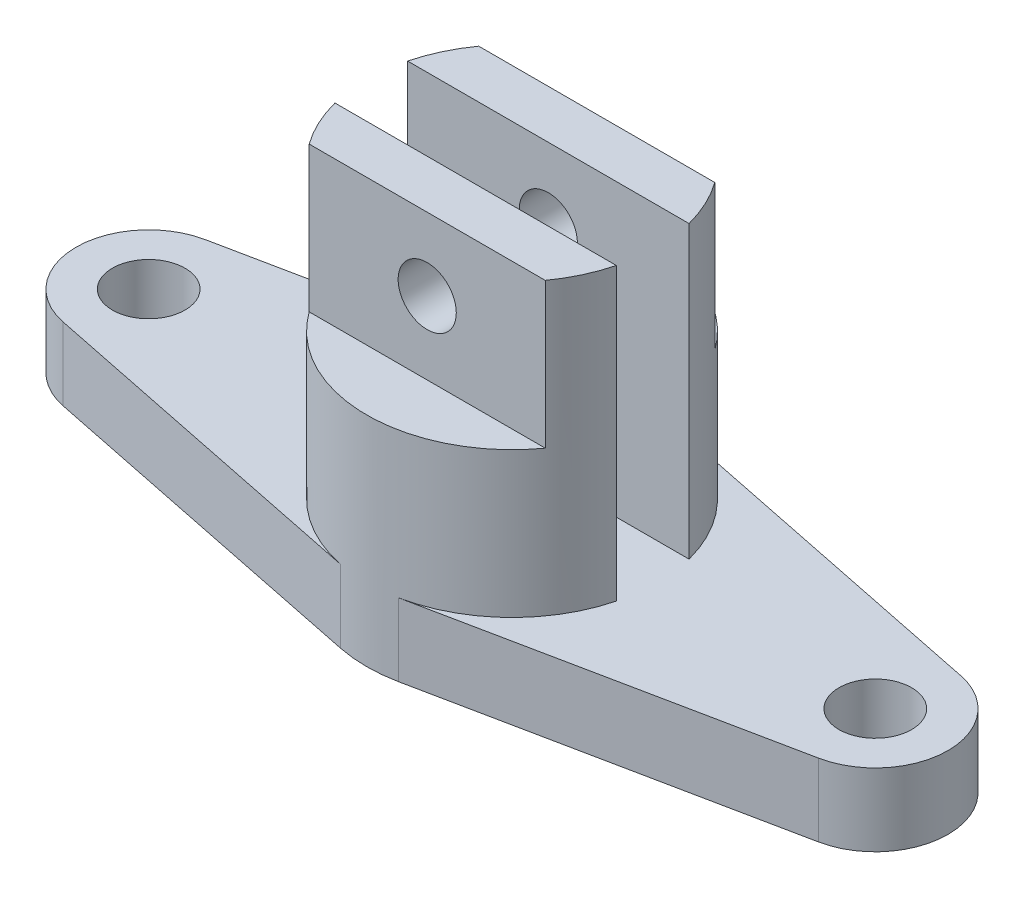
ISO-10303-21;
HEADER;
FILE_DESCRIPTION(('STEP AP214'),'2;1');
FILE_NAME('part.step','',(''),(''),'','','');
FILE_SCHEMA(('AUTOMOTIVE_DESIGN { 1 0 10303 214 1 1 1 1 }'));
ENDSEC;
DATA;
#1=APPLICATION_CONTEXT('core data for automotive mechanical design processes');
#2=APPLICATION_PROTOCOL_DEFINITION('international standard','automotive_design',2000,#1);
#3=PRODUCT_CONTEXT('',#1,'mechanical');
#4=PRODUCT('Part','Part','',(#3));
#5=PRODUCT_RELATED_PRODUCT_CATEGORY('part','',(#4));
#6=PRODUCT_DEFINITION_FORMATION('','',#4);
#7=PRODUCT_DEFINITION_CONTEXT('part definition',#1,'design');
#8=PRODUCT_DEFINITION('design','',#6,#7);
#9=PRODUCT_DEFINITION_SHAPE('','',#8);
#10=(LENGTH_UNIT() NAMED_UNIT(*) SI_UNIT(.MILLI.,.METRE.));
#11=(NAMED_UNIT(*) PLANE_ANGLE_UNIT() SI_UNIT($,.RADIAN.));
#12=(NAMED_UNIT(*) SI_UNIT($,.STERADIAN.) SOLID_ANGLE_UNIT());
#13=UNCERTAINTY_MEASURE_WITH_UNIT(LENGTH_MEASURE(1.E-05),#10,'distance_accuracy_value','');
#14=(GEOMETRIC_REPRESENTATION_CONTEXT(3) GLOBAL_UNCERTAINTY_ASSIGNED_CONTEXT((#13)) GLOBAL_UNIT_ASSIGNED_CONTEXT((#10,
#11,#12)) REPRESENTATION_CONTEXT('',''));
#15=CARTESIAN_POINT('',(0.,0.,0.));
#16=DIRECTION('',(0.,0.,1.));
#17=DIRECTION('',(1.,0.,0.));
#18=AXIS2_PLACEMENT_3D('',#15,#16,#17);
#19=CARTESIAN_POINT('',(0.,75.,0.));
#20=DIRECTION('',(0.,-1.,0.));
#21=DIRECTION('',(0.,0.,-1.));
#22=AXIS2_PLACEMENT_3D('',#19,#20,#21);
#23=CYLINDRICAL_SURFACE('',#22,30.);
#24=CARTESIAN_POINT('',(0.,15.,0.));
#25=DIRECTION('',(0.,1.,0.));
#26=DIRECTION('',(0.,0.,1.));
#27=AXIS2_PLACEMENT_3D('',#24,#25,#26);
#28=CIRCLE('',#27,30.);
#29=CARTESIAN_POINT('',(29.0473750965556,15.,-7.5));
#30=VERTEX_POINT('',#29);
#31=CARTESIAN_POINT('',(5.99999999999999,15.,-29.3938769133981));
#32=VERTEX_POINT('',#31);
#33=EDGE_CURVE('E62',#30,#32,#28,.T.);
#34=ORIENTED_EDGE('',*,*,#33,.T.);
#35=DIRECTION('',(0.,-1.,0.));
#36=VECTOR('',#35,1.);
#37=CARTESIAN_POINT('',(6.,15.,-29.3938769133981));
#38=LINE('',#37,#36);
#39=CARTESIAN_POINT('',(6.00000000000001,0.,-29.3938769133981));
#40=VERTEX_POINT('',#39);
#41=EDGE_CURVE('E258',#32,#40,#38,.T.);
#42=ORIENTED_EDGE('',*,*,#41,.T.);
#43=CARTESIAN_POINT('',(0.,0.,0.));
#44=DIRECTION('',(0.,1.,0.));
#45=DIRECTION('',(0.,0.,1.));
#46=AXIS2_PLACEMENT_3D('',#43,#44,#45);
#47=CIRCLE('',#46,30.);
#48=CARTESIAN_POINT('',(-6.,0.,-29.3938769133981));
#49=VERTEX_POINT('',#48);
#50=EDGE_CURVE('E270',#40,#49,#47,.T.);
#51=ORIENTED_EDGE('',*,*,#50,.T.);
#52=DIRECTION('',(0.,-1.,0.));
#53=VECTOR('',#52,1.);
#54=CARTESIAN_POINT('',(-6.,15.,-29.3938769133981));
#55=LINE('',#54,#53);
#56=CARTESIAN_POINT('',(-6.,15.,-29.3938769133981));
#57=VERTEX_POINT('',#56);
#58=EDGE_CURVE('E69',#57,#49,#55,.T.);
#59=ORIENTED_EDGE('',*,*,#58,.F.);
#60=CARTESIAN_POINT('',(-29.0473750965556,15.,-7.5));
#61=VERTEX_POINT('',#60);
#62=EDGE_CURVE('E212',#57,#61,#28,.T.);
#63=ORIENTED_EDGE('',*,*,#62,.T.);
#64=DIRECTION('',(0.,-1.,0.));
#65=VECTOR('',#64,1.);
#66=CARTESIAN_POINT('',(-29.0473750965556,75.,-7.5));
#67=LINE('',#66,#65);
#68=CARTESIAN_POINT('',(-29.0473750965556,75.,-7.5));
#69=VERTEX_POINT('',#68);
#70=EDGE_CURVE('E281',#69,#61,#67,.T.);
#71=ORIENTED_EDGE('',*,*,#70,.F.);
#72=CARTESIAN_POINT('',(0.,75.,0.));
#73=DIRECTION('',(0.,1.,0.));
#74=DIRECTION('',(0.,0.,1.));
#75=AXIS2_PLACEMENT_3D('',#72,#73,#74);
#76=CIRCLE('',#75,30.);
#77=CARTESIAN_POINT('',(-24.3669858620224,75.,-17.5));
#78=VERTEX_POINT('',#77);
#79=EDGE_CURVE('E277',#78,#69,#76,.T.);
#80=ORIENTED_EDGE('',*,*,#79,.F.);
#81=DIRECTION('',(0.,-1.,0.));
#82=VECTOR('',#81,1.);
#83=CARTESIAN_POINT('',(-24.3669858620224,75.,-17.5));
#84=LINE('',#83,#82);
#85=CARTESIAN_POINT('',(-24.3669858620224,45.,-17.5));
#86=VERTEX_POINT('',#85);
#87=EDGE_CURVE('E284',#78,#86,#84,.T.);
#88=ORIENTED_EDGE('',*,*,#87,.T.);
#89=CARTESIAN_POINT('',(0.,45.,0.));
#90=DIRECTION('',(0.,1.,0.));
#91=DIRECTION('',(0.,0.,1.));
#92=AXIS2_PLACEMENT_3D('',#89,#90,#91);
#93=CIRCLE('',#92,30.);
#94=CARTESIAN_POINT('',(24.3669858620224,45.,-17.5));
#95=VERTEX_POINT('',#94);
#96=EDGE_CURVE('E268',#95,#86,#93,.T.);
#97=ORIENTED_EDGE('',*,*,#96,.F.);
#98=DIRECTION('',(0.,-1.,0.));
#99=VECTOR('',#98,1.);
#100=CARTESIAN_POINT('',(24.3669858620224,75.,-17.5));
#101=LINE('',#100,#99);
#102=CARTESIAN_POINT('',(24.3669858620224,75.,-17.5));
#103=VERTEX_POINT('',#102);
#104=EDGE_CURVE('E56',#103,#95,#101,.T.);
#105=ORIENTED_EDGE('',*,*,#104,.F.);
#106=CARTESIAN_POINT('',(29.0473750965556,75.,-7.5));
#107=VERTEX_POINT('',#106);
#108=EDGE_CURVE('E274',#107,#103,#76,.T.);
#109=ORIENTED_EDGE('',*,*,#108,.F.);
#110=DIRECTION('',(0.,-1.,0.));
#111=VECTOR('',#110,1.);
#112=CARTESIAN_POINT('',(29.0473750965556,75.,-7.5));
#113=LINE('',#112,#111);
#114=EDGE_CURVE('E13',#107,#30,#113,.T.);
#115=ORIENTED_EDGE('',*,*,#114,.T.);
#116=EDGE_LOOP('',(#34,#42,#51,#59,#63,#71,#80,#88,#97,#105,#109,#115));
#117=FACE_BOUND('',#116,.T.);
#118=ADVANCED_FACE('F47',(#117),#23,.T.);
#119=CARTESIAN_POINT('',(0.,75.,-7.5));
#120=DIRECTION('',(0.,0.,1.));
#121=DIRECTION('',(1.,0.,0.));
#122=AXIS2_PLACEMENT_3D('',#119,#120,#121);
#123=PLANE('',#122);
#124=CARTESIAN_POINT('',(0.,60.,-7.5));
#125=DIRECTION('',(0.,0.,1.));
#126=DIRECTION('',(1.,0.,0.));
#127=AXIS2_PLACEMENT_3D('',#124,#125,#126);
#128=CIRCLE('',#127,6.);
#129=CARTESIAN_POINT('',(6.,60.,-7.5));
#130=VERTEX_POINT('',#129);
#131=EDGE_CURVE('E330',#130,#130,#128,.T.);
#132=ORIENTED_EDGE('',*,*,#131,.F.);
#133=EDGE_LOOP('',(#132));
#134=FACE_BOUND('',#133,.T.);
#135=DIRECTION('',(-1.,0.,0.));
#136=VECTOR('',#135,1.);
#137=CARTESIAN_POINT('',(0.,15.,-7.5));
#138=LINE('',#137,#136);
#139=EDGE_CURVE('E211',#30,#61,#138,.T.);
#140=ORIENTED_EDGE('',*,*,#139,.F.);
#141=ORIENTED_EDGE('',*,*,#114,.F.);
#142=DIRECTION('',(-1.,0.,0.));
#143=VECTOR('',#142,1.);
#144=CARTESIAN_POINT('',(0.,75.,-7.5));
#145=LINE('',#144,#143);
#146=EDGE_CURVE('E271',#107,#69,#145,.T.);
#147=ORIENTED_EDGE('',*,*,#146,.T.);
#148=ORIENTED_EDGE('',*,*,#70,.T.);
#149=EDGE_LOOP('',(#140,#141,#147,#148));
#150=FACE_BOUND('',#149,.T.);
#151=ADVANCED_FACE('F49',(#134,#150),#123,.T.);
#152=CARTESIAN_POINT('',(0.,75.,-17.5));
#153=DIRECTION('',(0.,0.,-1.));
#154=DIRECTION('',(-1.,0.,0.));
#155=AXIS2_PLACEMENT_3D('',#152,#153,#154);
#156=PLANE('',#155);
#157=CARTESIAN_POINT('',(0.,60.,-17.5));
#158=DIRECTION('',(0.,0.,-1.));
#159=DIRECTION('',(-1.,0.,0.));
#160=AXIS2_PLACEMENT_3D('',#157,#158,#159);
#161=CIRCLE('',#160,6.);
#162=CARTESIAN_POINT('',(-6.,60.,-17.5));
#163=VERTEX_POINT('',#162);
#164=EDGE_CURVE('E328',#163,#163,#161,.T.);
#165=ORIENTED_EDGE('',*,*,#164,.F.);
#166=EDGE_LOOP('',(#165));
#167=FACE_BOUND('',#166,.T.);
#168=DIRECTION('',(1.,0.,0.));
#169=VECTOR('',#168,1.);
#170=CARTESIAN_POINT('',(0.,45.,-17.5));
#171=LINE('',#170,#169);
#172=EDGE_CURVE('E265',#86,#95,#171,.T.);
#173=ORIENTED_EDGE('',*,*,#172,.F.);
#174=ORIENTED_EDGE('',*,*,#87,.F.);
#175=DIRECTION('',(1.,0.,0.));
#176=VECTOR('',#175,1.);
#177=CARTESIAN_POINT('',(0.,75.,-17.5));
#178=LINE('',#177,#176);
#179=EDGE_CURVE('E276',#78,#103,#178,.T.);
#180=ORIENTED_EDGE('',*,*,#179,.T.);
#181=ORIENTED_EDGE('',*,*,#104,.T.);
#182=EDGE_LOOP('',(#173,#174,#180,#181));
#183=FACE_BOUND('',#182,.T.);
#184=ADVANCED_FACE('F291',(#167,#183),#156,.T.);
#185=CARTESIAN_POINT('',(0.,75.,0.));
#186=DIRECTION('',(0.,1.,0.));
#187=DIRECTION('',(0.,0.,1.));
#188=AXIS2_PLACEMENT_3D('',#185,#186,#187);
#189=PLANE('',#188);
#190=ORIENTED_EDGE('',*,*,#146,.F.);
#191=ORIENTED_EDGE('',*,*,#108,.T.);
#192=ORIENTED_EDGE('',*,*,#179,.F.);
#193=ORIENTED_EDGE('',*,*,#79,.T.);
#194=EDGE_LOOP('',(#190,#191,#192,#193));
#195=FACE_BOUND('',#194,.T.);
#196=ADVANCED_FACE('F309',(#195),#189,.T.);
#197=CARTESIAN_POINT('',(0.,0.,0.));
#198=DIRECTION('',(0.,1.,0.));
#199=DIRECTION('',(0.,0.,1.));
#200=AXIS2_PLACEMENT_3D('',#197,#198,#199);
#201=PLANE('',#200);
#202=CARTESIAN_POINT('',(0.,0.,0.));
#203=DIRECTION('',(0.,1.,0.));
#204=DIRECTION('',(0.,0.,1.));
#205=AXIS2_PLACEMENT_3D('',#202,#203,#204);
#206=CIRCLE('',#205,30.);
#207=CARTESIAN_POINT('',(-6.,0.,29.3938769133981));
#208=VERTEX_POINT('',#207);
#209=CARTESIAN_POINT('',(6.,0.,29.3938769133981));
#210=VERTEX_POINT('',#209);
#211=EDGE_CURVE('E182',#208,#210,#206,.T.);
#212=ORIENTED_EDGE('',*,*,#211,.F.);
#213=DIRECTION('',(0.979795897113271,0.,0.2));
#214=VECTOR('',#213,1.);
#215=CARTESIAN_POINT('',(-6.,0.,29.3938769133981));
#216=LINE('',#215,#214);
#217=CARTESIAN_POINT('',(-78.,0.,14.6969384566991));
#218=VERTEX_POINT('',#217);
#219=EDGE_CURVE('E200',#218,#208,#216,.T.);
#220=ORIENTED_EDGE('',*,*,#219,.F.);
#221=CARTESIAN_POINT('',(-75.,0.,0.));
#222=DIRECTION('',(0.,1.,0.));
#223=DIRECTION('',(0.,0.,1.));
#224=AXIS2_PLACEMENT_3D('',#221,#222,#223);
#225=CIRCLE('',#224,15.);
#226=CARTESIAN_POINT('',(-78.,0.,-14.6969384566991));
#227=VERTEX_POINT('',#226);
#228=EDGE_CURVE('E244',#227,#218,#225,.T.);
#229=ORIENTED_EDGE('',*,*,#228,.F.);
#230=DIRECTION('',(0.979795897113271,0.,-0.2));
#231=VECTOR('',#230,1.);
#232=CARTESIAN_POINT('',(-6.,0.,-29.3938769133981));
#233=LINE('',#232,#231);
#234=EDGE_CURVE('E241',#227,#49,#233,.T.);
#235=ORIENTED_EDGE('',*,*,#234,.T.);
#236=ORIENTED_EDGE('',*,*,#50,.F.);
#237=DIRECTION('',(-0.979795897113271,0.,-0.2));
#238=VECTOR('',#237,1.);
#239=CARTESIAN_POINT('',(5.99999999999999,0.,-29.3938769133981));
#240=LINE('',#239,#238);
#241=CARTESIAN_POINT('',(78.,0.,-14.6969384566991));
#242=VERTEX_POINT('',#241);
#243=EDGE_CURVE('E238',#242,#40,#240,.T.);
#244=ORIENTED_EDGE('',*,*,#243,.F.);
#245=CARTESIAN_POINT('',(75.,0.,0.));
#246=DIRECTION('',(0.,1.,0.));
#247=DIRECTION('',(0.,0.,1.));
#248=AXIS2_PLACEMENT_3D('',#245,#246,#247);
#249=CIRCLE('',#248,15.);
#250=CARTESIAN_POINT('',(78.,0.,14.696938456699));
#251=VERTEX_POINT('',#250);
#252=EDGE_CURVE('E235',#251,#242,#249,.T.);
#253=ORIENTED_EDGE('',*,*,#252,.F.);
#254=DIRECTION('',(-0.979795897113271,0.,0.2));
#255=VECTOR('',#254,1.);
#256=CARTESIAN_POINT('',(5.99999999999999,0.,29.3938769133981));
#257=LINE('',#256,#255);
#258=EDGE_CURVE('E232',#251,#210,#257,.T.);
#259=ORIENTED_EDGE('',*,*,#258,.T.);
#260=EDGE_LOOP('',(#212,#220,#229,#235,#236,#244,#253,#259));
#261=FACE_BOUND('',#260,.T.);
#262=CARTESIAN_POINT('',(-75.,0.,0.));
#263=DIRECTION('',(0.,1.,0.));
#264=DIRECTION('',(0.,0.,1.));
#265=AXIS2_PLACEMENT_3D('',#262,#263,#264);
#266=CIRCLE('',#265,7.50000000000001);
#267=CARTESIAN_POINT('',(-75.,0.,7.50000000000001));
#268=VERTEX_POINT('',#267);
#269=EDGE_CURVE('E187',#268,#268,#266,.T.);
#270=ORIENTED_EDGE('',*,*,#269,.T.);
#271=EDGE_LOOP('',(#270));
#272=FACE_BOUND('',#271,.T.);
#273=CARTESIAN_POINT('',(75.,0.,0.));
#274=DIRECTION('',(0.,1.,0.));
#275=DIRECTION('',(0.,0.,1.));
#276=AXIS2_PLACEMENT_3D('',#273,#274,#275);
#277=CIRCLE('',#276,7.50000000000003);
#278=CARTESIAN_POINT('',(75.,0.,7.50000000000003));
#279=VERTEX_POINT('',#278);
#280=EDGE_CURVE('E190',#279,#279,#277,.T.);
#281=ORIENTED_EDGE('',*,*,#280,.T.);
#282=EDGE_LOOP('',(#281));
#283=FACE_BOUND('',#282,.T.);
#284=ADVANCED_FACE('F300',(#261,#272,#283),#201,.F.);
#285=CARTESIAN_POINT('',(0.,45.,0.));
#286=DIRECTION('',(0.,1.,0.));
#287=DIRECTION('',(0.,0.,1.));
#288=AXIS2_PLACEMENT_3D('',#285,#286,#287);
#289=PLANE('',#288);
#290=ORIENTED_EDGE('',*,*,#172,.T.);
#291=ORIENTED_EDGE('',*,*,#96,.T.);
#292=EDGE_LOOP('',(#290,#291));
#293=FACE_BOUND('',#292,.T.);
#294=ADVANCED_FACE('F297',(#293),#289,.T.);
#295=CARTESIAN_POINT('',(5.99999999999999,15.,29.3938769133981));
#296=DIRECTION('',(0.2,0.,0.979795897113271));
#297=DIRECTION('',(0.979795897113271,0.,-0.2));
#298=AXIS2_PLACEMENT_3D('',#295,#296,#297);
#299=PLANE('',#298);
#300=ORIENTED_EDGE('',*,*,#258,.F.);
#301=DIRECTION('',(0.,-1.,0.));
#302=VECTOR('',#301,1.);
#303=CARTESIAN_POINT('',(78.,15.,14.696938456699));
#304=LINE('',#303,#302);
#305=CARTESIAN_POINT('',(78.,15.,14.696938456699));
#306=VERTEX_POINT('',#305);
#307=EDGE_CURVE('E263',#306,#251,#304,.T.);
#308=ORIENTED_EDGE('',*,*,#307,.F.);
#309=DIRECTION('',(-0.979795897113271,0.,0.2));
#310=VECTOR('',#309,1.);
#311=CARTESIAN_POINT('',(5.99999999999999,15.,29.3938769133981));
#312=LINE('',#311,#310);
#313=CARTESIAN_POINT('',(6.,15.,29.3938769133981));
#314=VERTEX_POINT('',#313);
#315=EDGE_CURVE('E203',#306,#314,#312,.T.);
#316=ORIENTED_EDGE('',*,*,#315,.T.);
#317=DIRECTION('',(0.,-1.,0.));
#318=VECTOR('',#317,1.);
#319=CARTESIAN_POINT('',(6.,15.,29.3938769133981));
#320=LINE('',#319,#318);
#321=EDGE_CURVE('E248',#314,#210,#320,.T.);
#322=ORIENTED_EDGE('',*,*,#321,.T.);
#323=EDGE_LOOP('',(#300,#308,#316,#322));
#324=FACE_BOUND('',#323,.T.);
#325=ADVANCED_FACE('F299',(#324),#299,.T.);
#326=CARTESIAN_POINT('',(75.,15.,0.));
#327=DIRECTION('',(0.,-1.,0.));
#328=DIRECTION('',(0.,0.,-1.));
#329=AXIS2_PLACEMENT_3D('',#326,#327,#328);
#330=CYLINDRICAL_SURFACE('',#329,15.);
#331=ORIENTED_EDGE('',*,*,#252,.T.);
#332=DIRECTION('',(0.,-1.,0.));
#333=VECTOR('',#332,1.);
#334=CARTESIAN_POINT('',(78.,15.,-14.6969384566991));
#335=LINE('',#334,#333);
#336=CARTESIAN_POINT('',(78.,15.,-14.6969384566991));
#337=VERTEX_POINT('',#336);
#338=EDGE_CURVE('E260',#337,#242,#335,.T.);
#339=ORIENTED_EDGE('',*,*,#338,.F.);
#340=CARTESIAN_POINT('',(75.,15.,0.));
#341=DIRECTION('',(0.,1.,0.));
#342=DIRECTION('',(0.,0.,1.));
#343=AXIS2_PLACEMENT_3D('',#340,#341,#342);
#344=CIRCLE('',#343,15.);
#345=EDGE_CURVE('E205',#306,#337,#344,.T.);
#346=ORIENTED_EDGE('',*,*,#345,.F.);
#347=ORIENTED_EDGE('',*,*,#307,.T.);
#348=EDGE_LOOP('',(#331,#339,#346,#347));
#349=FACE_BOUND('',#348,.T.);
#350=ADVANCED_FACE('F306',(#349),#330,.T.);
#351=CARTESIAN_POINT('',(5.99999999999999,15.,-29.3938769133981));
#352=DIRECTION('',(-0.2,0.,0.979795897113271));
#353=DIRECTION('',(0.979795897113271,0.,0.2));
#354=AXIS2_PLACEMENT_3D('',#351,#352,#353);
#355=PLANE('',#354);
#356=ORIENTED_EDGE('',*,*,#243,.T.);
#357=ORIENTED_EDGE('',*,*,#41,.F.);
#358=DIRECTION('',(-0.979795897113271,0.,-0.2));
#359=VECTOR('',#358,1.);
#360=CARTESIAN_POINT('',(5.99999999999999,15.,-29.3938769133981));
#361=LINE('',#360,#359);
#362=EDGE_CURVE('E208',#337,#32,#361,.T.);
#363=ORIENTED_EDGE('',*,*,#362,.F.);
#364=ORIENTED_EDGE('',*,*,#338,.T.);
#365=EDGE_LOOP('',(#356,#357,#363,#364));
#366=FACE_BOUND('',#365,.T.);
#367=ADVANCED_FACE('F364',(#366),#355,.F.);
#368=CARTESIAN_POINT('',(-6.,15.,-29.3938769133981));
#369=DIRECTION('',(-0.2,0.,-0.979795897113271));
#370=DIRECTION('',(-0.979795897113271,0.,0.2));
#371=AXIS2_PLACEMENT_3D('',#368,#369,#370);
#372=PLANE('',#371);
#373=ORIENTED_EDGE('',*,*,#234,.F.);
#374=DIRECTION('',(0.,-1.,0.));
#375=VECTOR('',#374,1.);
#376=CARTESIAN_POINT('',(-78.,15.,-14.6969384566991));
#377=LINE('',#376,#375);
#378=CARTESIAN_POINT('',(-78.,15.,-14.6969384566991));
#379=VERTEX_POINT('',#378);
#380=EDGE_CURVE('E255',#379,#227,#377,.T.);
#381=ORIENTED_EDGE('',*,*,#380,.F.);
#382=DIRECTION('',(0.979795897113271,0.,-0.2));
#383=VECTOR('',#382,1.);
#384=CARTESIAN_POINT('',(-6.,15.,-29.3938769133981));
#385=LINE('',#384,#383);
#386=EDGE_CURVE('E215',#379,#57,#385,.T.);
#387=ORIENTED_EDGE('',*,*,#386,.T.);
#388=ORIENTED_EDGE('',*,*,#58,.T.);
#389=EDGE_LOOP('',(#373,#381,#387,#388));
#390=FACE_BOUND('',#389,.T.);
#391=ADVANCED_FACE('F368',(#390),#372,.T.);
#392=CARTESIAN_POINT('',(-75.,15.,0.));
#393=DIRECTION('',(0.,-1.,0.));
#394=DIRECTION('',(0.,0.,-1.));
#395=AXIS2_PLACEMENT_3D('',#392,#393,#394);
#396=CYLINDRICAL_SURFACE('',#395,15.);
#397=ORIENTED_EDGE('',*,*,#228,.T.);
#398=DIRECTION('',(0.,-1.,0.));
#399=VECTOR('',#398,1.);
#400=CARTESIAN_POINT('',(-78.,15.,14.6969384566991));
#401=LINE('',#400,#399);
#402=CARTESIAN_POINT('',(-78.,15.,14.6969384566991));
#403=VERTEX_POINT('',#402);
#404=EDGE_CURVE('E252',#403,#218,#401,.T.);
#405=ORIENTED_EDGE('',*,*,#404,.F.);
#406=CARTESIAN_POINT('',(-75.,15.,0.));
#407=DIRECTION('',(0.,1.,0.));
#408=DIRECTION('',(0.,0.,1.));
#409=AXIS2_PLACEMENT_3D('',#406,#407,#408);
#410=CIRCLE('',#409,15.);
#411=EDGE_CURVE('E218',#379,#403,#410,.T.);
#412=ORIENTED_EDGE('',*,*,#411,.F.);
#413=ORIENTED_EDGE('',*,*,#380,.T.);
#414=EDGE_LOOP('',(#397,#405,#412,#413));
#415=FACE_BOUND('',#414,.T.);
#416=ADVANCED_FACE('F376',(#415),#396,.T.);
#417=CARTESIAN_POINT('',(-6.,15.,29.3938769133981));
#418=DIRECTION('',(0.2,0.,-0.979795897113271));
#419=DIRECTION('',(-0.979795897113271,0.,-0.2));
#420=AXIS2_PLACEMENT_3D('',#417,#418,#419);
#421=PLANE('',#420);
#422=ORIENTED_EDGE('',*,*,#219,.T.);
#423=DIRECTION('',(0.,-1.,0.));
#424=VECTOR('',#423,1.);
#425=CARTESIAN_POINT('',(-6.,15.,29.3938769133981));
#426=LINE('',#425,#424);
#427=CARTESIAN_POINT('',(-6.,15.,29.3938769133981));
#428=VERTEX_POINT('',#427);
#429=EDGE_CURVE('E250',#428,#208,#426,.T.);
#430=ORIENTED_EDGE('',*,*,#429,.F.);
#431=DIRECTION('',(0.979795897113271,0.,0.2));
#432=VECTOR('',#431,1.);
#433=CARTESIAN_POINT('',(-6.,15.,29.3938769133981));
#434=LINE('',#433,#432);
#435=EDGE_CURVE('E221',#403,#428,#434,.T.);
#436=ORIENTED_EDGE('',*,*,#435,.F.);
#437=ORIENTED_EDGE('',*,*,#404,.T.);
#438=EDGE_LOOP('',(#422,#430,#436,#437));
#439=FACE_BOUND('',#438,.T.);
#440=ADVANCED_FACE('F378',(#439),#421,.F.);
#441=CARTESIAN_POINT('',(75.,15.,0.));
#442=DIRECTION('',(0.,-1.,0.));
#443=DIRECTION('',(0.,0.,-1.));
#444=AXIS2_PLACEMENT_3D('',#441,#442,#443);
#445=CYLINDRICAL_SURFACE('',#444,7.50000000000003);
#446=CARTESIAN_POINT('',(75.,15.,0.));
#447=DIRECTION('',(0.,1.,0.));
#448=DIRECTION('',(0.,0.,1.));
#449=AXIS2_PLACEMENT_3D('',#446,#447,#448);
#450=CIRCLE('',#449,7.50000000000003);
#451=CARTESIAN_POINT('',(75.,15.,7.50000000000003));
#452=VERTEX_POINT('',#451);
#453=EDGE_CURVE('E199',#452,#452,#450,.T.);
#454=ORIENTED_EDGE('',*,*,#453,.T.);
#455=EDGE_LOOP('',(#454));
#456=FACE_BOUND('',#455,.T.);
#457=ORIENTED_EDGE('',*,*,#280,.F.);
#458=EDGE_LOOP('',(#457));
#459=FACE_BOUND('',#458,.T.);
#460=ADVANCED_FACE('F380',(#456,#459),#445,.F.);
#461=CARTESIAN_POINT('',(-75.,15.,0.));
#462=DIRECTION('',(0.,-1.,0.));
#463=DIRECTION('',(0.,0.,-1.));
#464=AXIS2_PLACEMENT_3D('',#461,#462,#463);
#465=CYLINDRICAL_SURFACE('',#464,7.50000000000001);
#466=CARTESIAN_POINT('',(-75.,15.,0.));
#467=DIRECTION('',(0.,1.,0.));
#468=DIRECTION('',(0.,0.,1.));
#469=AXIS2_PLACEMENT_3D('',#466,#467,#468);
#470=CIRCLE('',#469,7.50000000000001);
#471=CARTESIAN_POINT('',(-75.,15.,7.50000000000001));
#472=VERTEX_POINT('',#471);
#473=EDGE_CURVE('E196',#472,#472,#470,.T.);
#474=ORIENTED_EDGE('',*,*,#473,.T.);
#475=EDGE_LOOP('',(#474));
#476=FACE_BOUND('',#475,.T.);
#477=ORIENTED_EDGE('',*,*,#269,.F.);
#478=EDGE_LOOP('',(#477));
#479=FACE_BOUND('',#478,.T.);
#480=ADVANCED_FACE('F386',(#476,#479),#465,.F.);
#481=CARTESIAN_POINT('',(0.,15.,0.));
#482=DIRECTION('',(0.,1.,0.));
#483=DIRECTION('',(0.,0.,1.));
#484=AXIS2_PLACEMENT_3D('',#481,#482,#483);
#485=PLANE('',#484);
#486=ORIENTED_EDGE('',*,*,#473,.F.);
#487=EDGE_LOOP('',(#486));
#488=FACE_BOUND('',#487,.T.);
#489=ORIENTED_EDGE('',*,*,#453,.F.);
#490=EDGE_LOOP('',(#489));
#491=FACE_BOUND('',#490,.T.);
#492=ORIENTED_EDGE('',*,*,#315,.F.);
#493=ORIENTED_EDGE('',*,*,#345,.T.);
#494=ORIENTED_EDGE('',*,*,#362,.T.);
#495=ORIENTED_EDGE('',*,*,#33,.F.);
#496=ORIENTED_EDGE('',*,*,#139,.T.);
#497=ORIENTED_EDGE('',*,*,#62,.F.);
#498=ORIENTED_EDGE('',*,*,#386,.F.);
#499=ORIENTED_EDGE('',*,*,#411,.T.);
#500=ORIENTED_EDGE('',*,*,#435,.T.);
#501=CARTESIAN_POINT('',(0.,15.,0.));
#502=DIRECTION('',(0.,1.,0.));
#503=DIRECTION('',(0.,0.,1.));
#504=AXIS2_PLACEMENT_3D('',#501,#502,#503);
#505=CIRCLE('',#504,30.);
#506=CARTESIAN_POINT('',(-29.0473750965556,15.,7.5));
#507=VERTEX_POINT('',#506);
#508=EDGE_CURVE('E223',#507,#428,#505,.T.);
#509=ORIENTED_EDGE('',*,*,#508,.F.);
#510=DIRECTION('',(-1.,0.,0.));
#511=VECTOR('',#510,1.);
#512=CARTESIAN_POINT('',(0.,15.,7.5));
#513=LINE('',#512,#511);
#514=CARTESIAN_POINT('',(29.0473750965556,15.,7.5));
#515=VERTEX_POINT('',#514);
#516=EDGE_CURVE('E226',#515,#507,#513,.T.);
#517=ORIENTED_EDGE('',*,*,#516,.F.);
#518=EDGE_CURVE('E227',#314,#515,#505,.T.);
#519=ORIENTED_EDGE('',*,*,#518,.F.);
#520=EDGE_LOOP('',(#492,#493,#494,#495,#496,#497,#498,#499,#500,#509,#517,#519));
#521=FACE_BOUND('',#520,.T.);
#522=ADVANCED_FACE('F352',(#488,#491,#521),#485,.T.);
#523=CARTESIAN_POINT('',(0.,75.,0.));
#524=DIRECTION('',(0.,-1.,0.));
#525=DIRECTION('',(0.,0.,-1.));
#526=AXIS2_PLACEMENT_3D('',#523,#524,#525);
#527=CYLINDRICAL_SURFACE('',#526,30.);
#528=ORIENTED_EDGE('',*,*,#429,.T.);
#529=ORIENTED_EDGE('',*,*,#211,.T.);
#530=ORIENTED_EDGE('',*,*,#321,.F.);
#531=ORIENTED_EDGE('',*,*,#518,.T.);
#532=DIRECTION('',(0.,-1.,0.));
#533=VECTOR('',#532,1.);
#534=CARTESIAN_POINT('',(29.0473750965556,75.,7.5));
#535=LINE('',#534,#533);
#536=CARTESIAN_POINT('',(29.0473750965556,75.,7.5));
#537=VERTEX_POINT('',#536);
#538=EDGE_CURVE('E170',#537,#515,#535,.T.);
#539=ORIENTED_EDGE('',*,*,#538,.F.);
#540=CARTESIAN_POINT('',(0.,75.,0.));
#541=DIRECTION('',(0.,1.,0.));
#542=DIRECTION('',(0.,0.,1.));
#543=AXIS2_PLACEMENT_3D('',#540,#541,#542);
#544=CIRCLE('',#543,30.);
#545=CARTESIAN_POINT('',(24.3669858620224,75.,17.5));
#546=VERTEX_POINT('',#545);
#547=EDGE_CURVE('E160',#546,#537,#544,.T.);
#548=ORIENTED_EDGE('',*,*,#547,.F.);
#549=DIRECTION('',(0.,-1.,0.));
#550=VECTOR('',#549,1.);
#551=CARTESIAN_POINT('',(24.3669858620224,75.,17.5));
#552=LINE('',#551,#550);
#553=CARTESIAN_POINT('',(24.3669858620224,45.,17.5));
#554=VERTEX_POINT('',#553);
#555=EDGE_CURVE('E166',#546,#554,#552,.T.);
#556=ORIENTED_EDGE('',*,*,#555,.T.);
#557=CARTESIAN_POINT('',(0.,45.,0.));
#558=DIRECTION('',(0.,1.,0.));
#559=DIRECTION('',(0.,0.,1.));
#560=AXIS2_PLACEMENT_3D('',#557,#558,#559);
#561=CIRCLE('',#560,30.);
#562=CARTESIAN_POINT('',(-24.3669858620224,45.,17.5));
#563=VERTEX_POINT('',#562);
#564=EDGE_CURVE('E333',#563,#554,#561,.T.);
#565=ORIENTED_EDGE('',*,*,#564,.F.);
#566=DIRECTION('',(0.,-1.,0.));
#567=VECTOR('',#566,1.);
#568=CARTESIAN_POINT('',(-24.3669858620224,75.,17.5));
#569=LINE('',#568,#567);
#570=CARTESIAN_POINT('',(-24.3669858620224,75.,17.5));
#571=VERTEX_POINT('',#570);
#572=EDGE_CURVE('E344',#571,#563,#569,.T.);
#573=ORIENTED_EDGE('',*,*,#572,.F.);
#574=CARTESIAN_POINT('',(-29.0473750965556,75.,7.5));
#575=VERTEX_POINT('',#574);
#576=EDGE_CURVE('E176',#575,#571,#544,.T.);
#577=ORIENTED_EDGE('',*,*,#576,.F.);
#578=DIRECTION('',(0.,-1.,0.));
#579=VECTOR('',#578,1.);
#580=CARTESIAN_POINT('',(-29.0473750965556,75.,7.5));
#581=LINE('',#580,#579);
#582=EDGE_CURVE('E192',#575,#507,#581,.T.);
#583=ORIENTED_EDGE('',*,*,#582,.T.);
#584=ORIENTED_EDGE('',*,*,#508,.T.);
#585=EDGE_LOOP('',(#528,#529,#530,#531,#539,#548,#556,#565,#573,#577,#583,#584));
#586=FACE_BOUND('',#585,.T.);
#587=ADVANCED_FACE('F163',(#586),#527,.T.);
#588=CARTESIAN_POINT('',(0.,75.,17.5));
#589=DIRECTION('',(0.,0.,-1.));
#590=DIRECTION('',(-1.,0.,0.));
#591=AXIS2_PLACEMENT_3D('',#588,#589,#590);
#592=PLANE('',#591);
#593=CARTESIAN_POINT('',(0.,60.,17.5));
#594=DIRECTION('',(0.,0.,1.));
#595=DIRECTION('',(1.,0.,0.));
#596=AXIS2_PLACEMENT_3D('',#593,#594,#595);
#597=CIRCLE('',#596,6.);
#598=CARTESIAN_POINT('',(6.,60.,17.5));
#599=VERTEX_POINT('',#598);
#600=EDGE_CURVE('E336',#599,#599,#597,.T.);
#601=ORIENTED_EDGE('',*,*,#600,.F.);
#602=EDGE_LOOP('',(#601));
#603=FACE_BOUND('',#602,.T.);
#604=ORIENTED_EDGE('',*,*,#572,.T.);
#605=DIRECTION('',(1.,0.,0.));
#606=VECTOR('',#605,1.);
#607=CARTESIAN_POINT('',(0.,45.,17.5));
#608=LINE('',#607,#606);
#609=EDGE_CURVE('E186',#563,#554,#608,.T.);
#610=ORIENTED_EDGE('',*,*,#609,.T.);
#611=ORIENTED_EDGE('',*,*,#555,.F.);
#612=DIRECTION('',(1.,0.,0.));
#613=VECTOR('',#612,1.);
#614=CARTESIAN_POINT('',(0.,75.,17.5));
#615=LINE('',#614,#613);
#616=EDGE_CURVE('E174',#571,#546,#615,.T.);
#617=ORIENTED_EDGE('',*,*,#616,.F.);
#618=EDGE_LOOP('',(#604,#610,#611,#617));
#619=FACE_BOUND('',#618,.T.);
#620=ADVANCED_FACE('F184',(#603,#619),#592,.F.);
#621=CARTESIAN_POINT('',(0.,75.,7.5));
#622=DIRECTION('',(0.,0.,1.));
#623=DIRECTION('',(1.,0.,0.));
#624=AXIS2_PLACEMENT_3D('',#621,#622,#623);
#625=PLANE('',#624);
#626=CARTESIAN_POINT('',(0.,60.,7.5));
#627=DIRECTION('',(0.,0.,1.));
#628=DIRECTION('',(1.,0.,0.));
#629=AXIS2_PLACEMENT_3D('',#626,#627,#628);
#630=CIRCLE('',#629,6.);
#631=CARTESIAN_POINT('',(6.,60.,7.5));
#632=VERTEX_POINT('',#631);
#633=EDGE_CURVE('E51',#632,#632,#630,.T.);
#634=ORIENTED_EDGE('',*,*,#633,.T.);
#635=EDGE_LOOP('',(#634));
#636=FACE_BOUND('',#635,.T.);
#637=ORIENTED_EDGE('',*,*,#516,.T.);
#638=ORIENTED_EDGE('',*,*,#582,.F.);
#639=DIRECTION('',(-1.,0.,0.));
#640=VECTOR('',#639,1.);
#641=CARTESIAN_POINT('',(0.,75.,7.5));
#642=LINE('',#641,#640);
#643=EDGE_CURVE('E173',#537,#575,#642,.T.);
#644=ORIENTED_EDGE('',*,*,#643,.F.);
#645=ORIENTED_EDGE('',*,*,#538,.T.);
#646=EDGE_LOOP('',(#637,#638,#644,#645));
#647=FACE_BOUND('',#646,.T.);
#648=ADVANCED_FACE('F348',(#636,#647),#625,.F.);
#649=CARTESIAN_POINT('',(0.,75.,0.));
#650=DIRECTION('',(0.,1.,0.));
#651=DIRECTION('',(0.,0.,1.));
#652=AXIS2_PLACEMENT_3D('',#649,#650,#651);
#653=PLANE('',#652);
#654=ORIENTED_EDGE('',*,*,#616,.T.);
#655=ORIENTED_EDGE('',*,*,#547,.T.);
#656=ORIENTED_EDGE('',*,*,#643,.T.);
#657=ORIENTED_EDGE('',*,*,#576,.T.);
#658=EDGE_LOOP('',(#654,#655,#656,#657));
#659=FACE_BOUND('',#658,.T.);
#660=ADVANCED_FACE('F178',(#659),#653,.T.);
#661=CARTESIAN_POINT('',(0.,45.,0.));
#662=DIRECTION('',(0.,1.,0.));
#663=DIRECTION('',(0.,0.,1.));
#664=AXIS2_PLACEMENT_3D('',#661,#662,#663);
#665=PLANE('',#664);
#666=ORIENTED_EDGE('',*,*,#564,.T.);
#667=ORIENTED_EDGE('',*,*,#609,.F.);
#668=EDGE_LOOP('',(#666,#667));
#669=FACE_BOUND('',#668,.T.);
#670=ADVANCED_FACE('F428',(#669),#665,.T.);
#671=CARTESIAN_POINT('',(0.,60.,-30.));
#672=DIRECTION('',(0.,0.,1.));
#673=DIRECTION('',(1.,0.,0.));
#674=AXIS2_PLACEMENT_3D('',#671,#672,#673);
#675=CYLINDRICAL_SURFACE('',#674,6.);
#676=ORIENTED_EDGE('',*,*,#600,.T.);
#677=EDGE_LOOP('',(#676));
#678=FACE_BOUND('',#677,.T.);
#679=ORIENTED_EDGE('',*,*,#633,.F.);
#680=EDGE_LOOP('',(#679));
#681=FACE_BOUND('',#680,.T.);
#682=ADVANCED_FACE('F431',(#678,#681),#675,.F.);
#683=ORIENTED_EDGE('',*,*,#131,.T.);
#684=EDGE_LOOP('',(#683));
#685=FACE_BOUND('',#684,.T.);
#686=ORIENTED_EDGE('',*,*,#164,.T.);
#687=EDGE_LOOP('',(#686));
#688=FACE_BOUND('',#687,.T.);
#689=ADVANCED_FACE('F433',(#685,#688),#675,.F.);
#690=CLOSED_SHELL('',(#118,#151,#184,#196,#284,#294,#325,#350,#367,#391,#416,#440,#460,#480,
#522,#587,#620,#648,#660,#670,#682,#689));
#691=MANIFOLD_SOLID_BREP('B2',#690);
#692=ADVANCED_BREP_SHAPE_REPRESENTATION('',(#18,#691),#14);
#693=SHAPE_DEFINITION_REPRESENTATION(#9,#692);
ENDSEC;
END-ISO-10303-21;
